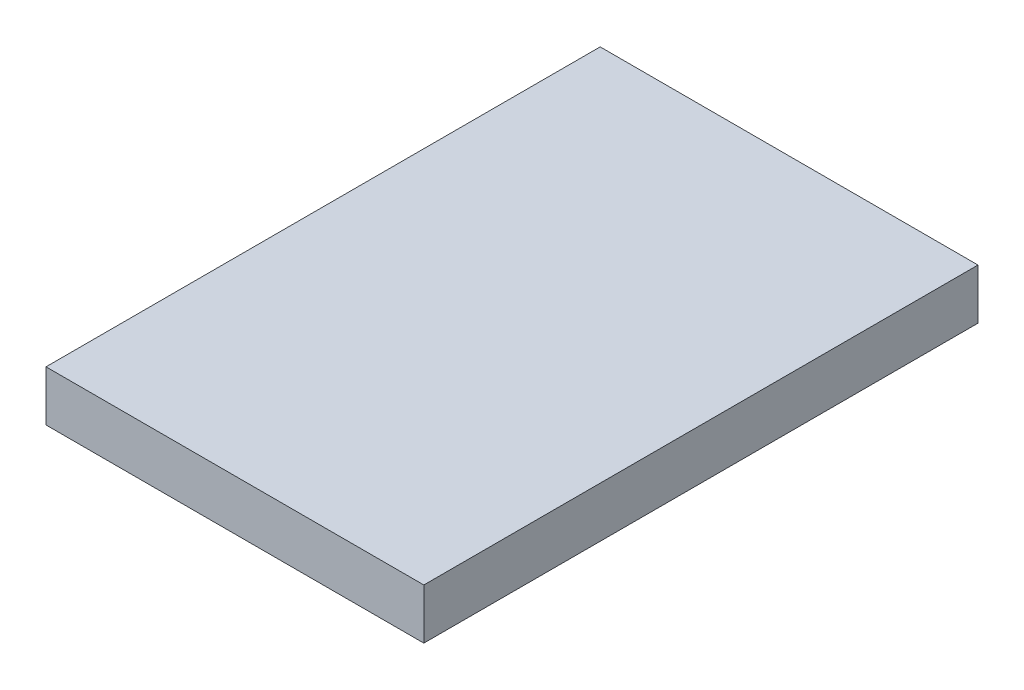
ISO-10303-21;
HEADER;
FILE_DESCRIPTION(('STEP AP214'),'2;1');
FILE_NAME('part.step','',(''),(''),'','','');
FILE_SCHEMA(('AUTOMOTIVE_DESIGN { 1 0 10303 214 1 1 1 1 }'));
ENDSEC;
DATA;
#1=APPLICATION_CONTEXT('core data for automotive mechanical design processes');
#2=APPLICATION_PROTOCOL_DEFINITION('international standard','automotive_design',2000,#1);
#3=PRODUCT_CONTEXT('',#1,'mechanical');
#4=PRODUCT('Part','Part','',(#3));
#5=PRODUCT_RELATED_PRODUCT_CATEGORY('part','',(#4));
#6=PRODUCT_DEFINITION_FORMATION('','',#4);
#7=PRODUCT_DEFINITION_CONTEXT('part definition',#1,'design');
#8=PRODUCT_DEFINITION('design','',#6,#7);
#9=PRODUCT_DEFINITION_SHAPE('','',#8);
#10=(LENGTH_UNIT() NAMED_UNIT(*) SI_UNIT(.MILLI.,.METRE.));
#11=(NAMED_UNIT(*) PLANE_ANGLE_UNIT() SI_UNIT($,.RADIAN.));
#12=(NAMED_UNIT(*) SI_UNIT($,.STERADIAN.) SOLID_ANGLE_UNIT());
#13=UNCERTAINTY_MEASURE_WITH_UNIT(LENGTH_MEASURE(1.E-05),#10,'distance_accuracy_value','');
#14=(GEOMETRIC_REPRESENTATION_CONTEXT(3) GLOBAL_UNCERTAINTY_ASSIGNED_CONTEXT((#13)) GLOBAL_UNIT_ASSIGNED_CONTEXT((#10,
#11,#12)) REPRESENTATION_CONTEXT('',''));
#15=CARTESIAN_POINT('',(0.,0.,0.));
#16=DIRECTION('',(0.,0.,1.));
#17=DIRECTION('',(1.,0.,0.));
#18=AXIS2_PLACEMENT_3D('',#15,#16,#17);
#19=CARTESIAN_POINT('',(0.,10.,0.));
#20=DIRECTION('',(1.,0.,0.));
#21=DIRECTION('',(0.,0.,-1.));
#22=AXIS2_PLACEMENT_3D('',#19,#20,#21);
#23=PLANE('',#22);
#24=DIRECTION('',(0.,0.,1.));
#25=VECTOR('',#24,1.);
#26=CARTESIAN_POINT('',(0.,0.,0.));
#27=LINE('',#26,#25);
#28=CARTESIAN_POINT('',(0.,0.,-110.));
#29=VERTEX_POINT('',#28);
#30=CARTESIAN_POINT('',(0.,0.,0.));
#31=VERTEX_POINT('',#30);
#32=EDGE_CURVE('E96',#29,#31,#27,.T.);
#33=ORIENTED_EDGE('',*,*,#32,.T.);
#34=DIRECTION('',(0.,-1.,0.));
#35=VECTOR('',#34,1.);
#36=CARTESIAN_POINT('',(0.,10.,0.));
#37=LINE('',#36,#35);
#38=CARTESIAN_POINT('',(0.,10.,0.));
#39=VERTEX_POINT('',#38);
#40=EDGE_CURVE('E11',#39,#31,#37,.T.);
#41=ORIENTED_EDGE('',*,*,#40,.F.);
#42=DIRECTION('',(0.,0.,1.));
#43=VECTOR('',#42,1.);
#44=CARTESIAN_POINT('',(0.,10.,0.));
#45=LINE('',#44,#43);
#46=CARTESIAN_POINT('',(0.,10.,-110.));
#47=VERTEX_POINT('',#46);
#48=EDGE_CURVE('E84',#47,#39,#45,.T.);
#49=ORIENTED_EDGE('',*,*,#48,.F.);
#50=DIRECTION('',(0.,-1.,0.));
#51=VECTOR('',#50,1.);
#52=CARTESIAN_POINT('',(0.,10.,-110.));
#53=LINE('',#52,#51);
#54=EDGE_CURVE('E92',#47,#29,#53,.T.);
#55=ORIENTED_EDGE('',*,*,#54,.T.);
#56=EDGE_LOOP('',(#33,#41,#49,#55));
#57=FACE_BOUND('',#56,.T.);
#58=ADVANCED_FACE('F33',(#57),#23,.F.);
#59=CARTESIAN_POINT('',(0.,10.,0.));
#60=DIRECTION('',(0.,0.,-1.));
#61=DIRECTION('',(-1.,0.,0.));
#62=AXIS2_PLACEMENT_3D('',#59,#60,#61);
#63=PLANE('',#62);
#64=DIRECTION('',(1.,0.,0.));
#65=VECTOR('',#64,1.);
#66=CARTESIAN_POINT('',(0.,0.,0.));
#67=LINE('',#66,#65);
#68=CARTESIAN_POINT('',(75.,0.,0.));
#69=VERTEX_POINT('',#68);
#70=EDGE_CURVE('E88',#31,#69,#67,.T.);
#71=ORIENTED_EDGE('',*,*,#70,.T.);
#72=DIRECTION('',(0.,-1.,0.));
#73=VECTOR('',#72,1.);
#74=CARTESIAN_POINT('',(75.,10.,0.));
#75=LINE('',#74,#73);
#76=CARTESIAN_POINT('',(75.,10.,0.));
#77=VERTEX_POINT('',#76);
#78=EDGE_CURVE('E41',#77,#69,#75,.T.);
#79=ORIENTED_EDGE('',*,*,#78,.F.);
#80=DIRECTION('',(1.,0.,0.));
#81=VECTOR('',#80,1.);
#82=CARTESIAN_POINT('',(0.,10.,0.));
#83=LINE('',#82,#81);
#84=EDGE_CURVE('E79',#39,#77,#83,.T.);
#85=ORIENTED_EDGE('',*,*,#84,.F.);
#86=ORIENTED_EDGE('',*,*,#40,.T.);
#87=EDGE_LOOP('',(#71,#79,#85,#86));
#88=FACE_BOUND('',#87,.T.);
#89=ADVANCED_FACE('F87',(#88),#63,.F.);
#90=CARTESIAN_POINT('',(75.,10.,0.));
#91=DIRECTION('',(-1.,0.,0.));
#92=DIRECTION('',(0.,0.,1.));
#93=AXIS2_PLACEMENT_3D('',#90,#91,#92);
#94=PLANE('',#93);
#95=DIRECTION('',(0.,0.,-1.));
#96=VECTOR('',#95,1.);
#97=CARTESIAN_POINT('',(75.,0.,0.));
#98=LINE('',#97,#96);
#99=CARTESIAN_POINT('',(75.,0.,-110.));
#100=VERTEX_POINT('',#99);
#101=EDGE_CURVE('E66',#69,#100,#98,.T.);
#102=ORIENTED_EDGE('',*,*,#101,.T.);
#103=DIRECTION('',(0.,-1.,0.));
#104=VECTOR('',#103,1.);
#105=CARTESIAN_POINT('',(75.,10.,-110.));
#106=LINE('',#105,#104);
#107=CARTESIAN_POINT('',(75.,10.,-110.));
#108=VERTEX_POINT('',#107);
#109=EDGE_CURVE('E89',#108,#100,#106,.T.);
#110=ORIENTED_EDGE('',*,*,#109,.F.);
#111=DIRECTION('',(0.,0.,-1.));
#112=VECTOR('',#111,1.);
#113=CARTESIAN_POINT('',(75.,10.,0.));
#114=LINE('',#113,#112);
#115=EDGE_CURVE('E82',#77,#108,#114,.T.);
#116=ORIENTED_EDGE('',*,*,#115,.F.);
#117=ORIENTED_EDGE('',*,*,#78,.T.);
#118=EDGE_LOOP('',(#102,#110,#116,#117));
#119=FACE_BOUND('',#118,.T.);
#120=ADVANCED_FACE('F90',(#119),#94,.F.);
#121=CARTESIAN_POINT('',(0.,10.,-110.));
#122=DIRECTION('',(0.,0.,1.));
#123=DIRECTION('',(1.,0.,0.));
#124=AXIS2_PLACEMENT_3D('',#121,#122,#123);
#125=PLANE('',#124);
#126=DIRECTION('',(-1.,0.,0.));
#127=VECTOR('',#126,1.);
#128=CARTESIAN_POINT('',(0.,0.,-110.));
#129=LINE('',#128,#127);
#130=EDGE_CURVE('E72',#100,#29,#129,.T.);
#131=ORIENTED_EDGE('',*,*,#130,.T.);
#132=ORIENTED_EDGE('',*,*,#54,.F.);
#133=DIRECTION('',(-1.,0.,0.));
#134=VECTOR('',#133,1.);
#135=CARTESIAN_POINT('',(0.,10.,-110.));
#136=LINE('',#135,#134);
#137=EDGE_CURVE('E49',#108,#47,#136,.T.);
#138=ORIENTED_EDGE('',*,*,#137,.F.);
#139=ORIENTED_EDGE('',*,*,#109,.T.);
#140=EDGE_LOOP('',(#131,#132,#138,#139));
#141=FACE_BOUND('',#140,.T.);
#142=ADVANCED_FACE('F103',(#141),#125,.F.);
#143=CARTESIAN_POINT('',(0.,10.,0.));
#144=DIRECTION('',(0.,-1.,0.));
#145=DIRECTION('',(0.,0.,-1.));
#146=AXIS2_PLACEMENT_3D('',#143,#144,#145);
#147=PLANE('',#146);
#148=ORIENTED_EDGE('',*,*,#48,.T.);
#149=ORIENTED_EDGE('',*,*,#84,.T.);
#150=ORIENTED_EDGE('',*,*,#115,.T.);
#151=ORIENTED_EDGE('',*,*,#137,.T.);
#152=EDGE_LOOP('',(#148,#149,#150,#151));
#153=FACE_BOUND('',#152,.T.);
#154=ADVANCED_FACE('F80',(#153),#147,.F.);
#155=CARTESIAN_POINT('',(0.,0.,0.));
#156=DIRECTION('',(0.,-1.,0.));
#157=DIRECTION('',(0.,0.,-1.));
#158=AXIS2_PLACEMENT_3D('',#155,#156,#157);
#159=PLANE('',#158);
#160=ORIENTED_EDGE('',*,*,#32,.F.);
#161=ORIENTED_EDGE('',*,*,#130,.F.);
#162=ORIENTED_EDGE('',*,*,#101,.F.);
#163=ORIENTED_EDGE('',*,*,#70,.F.);
#164=EDGE_LOOP('',(#160,#161,#162,#163));
#165=FACE_BOUND('',#164,.T.);
#166=ADVANCED_FACE('F106',(#165),#159,.T.);
#167=CLOSED_SHELL('',(#58,#89,#120,#142,#154,#166));
#168=MANIFOLD_SOLID_BREP('B2',#167);
#169=ADVANCED_BREP_SHAPE_REPRESENTATION('',(#18,#168),#14);
#170=SHAPE_DEFINITION_REPRESENTATION(#9,#169);
ENDSEC;
END-ISO-10303-21;
